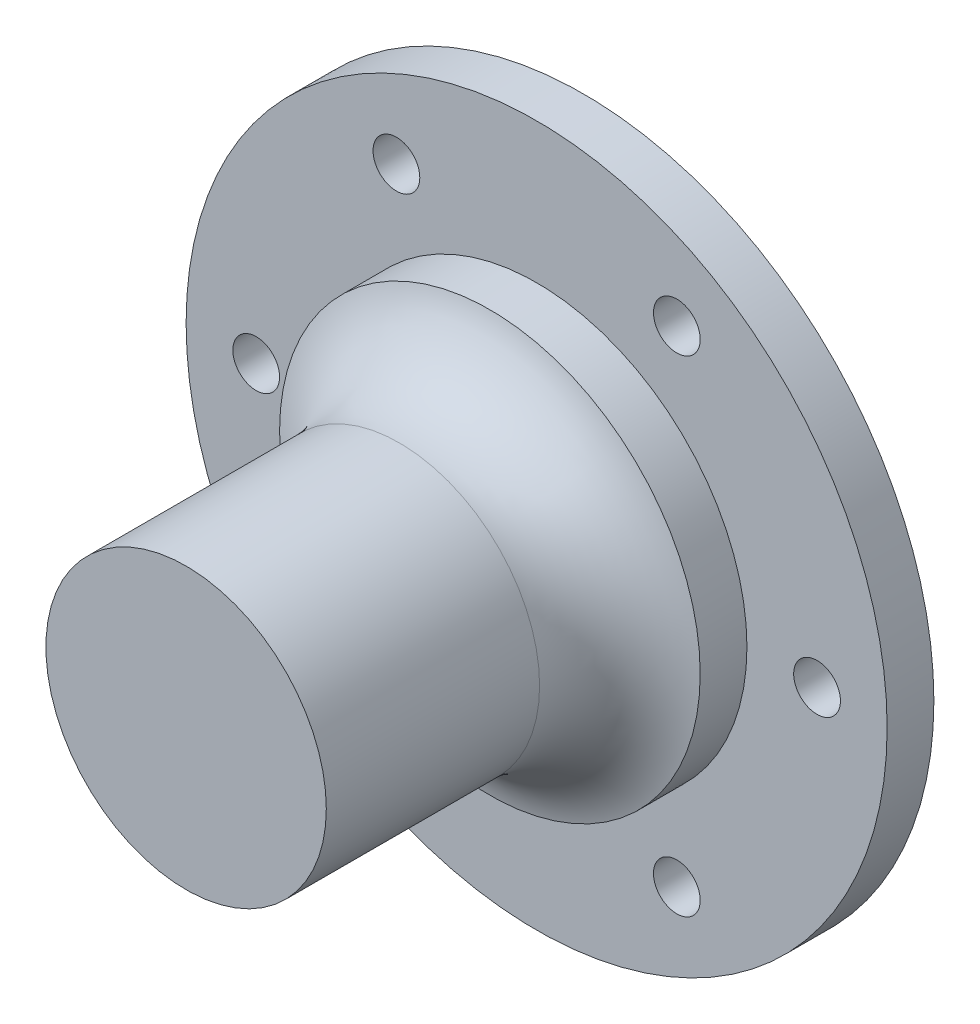
ISO-10303-21;
HEADER;
FILE_DESCRIPTION(('STEP AP214'),'2;1');
FILE_NAME('part.step','',(''),(''),'','','');
FILE_SCHEMA(('AUTOMOTIVE_DESIGN { 1 0 10303 214 1 1 1 1 }'));
ENDSEC;
DATA;
#1=APPLICATION_CONTEXT('core data for automotive mechanical design processes');
#2=APPLICATION_PROTOCOL_DEFINITION('international standard','automotive_design',2000,#1);
#3=PRODUCT_CONTEXT('',#1,'mechanical');
#4=PRODUCT('Part','Part','',(#3));
#5=PRODUCT_RELATED_PRODUCT_CATEGORY('part','',(#4));
#6=PRODUCT_DEFINITION_FORMATION('','',#4);
#7=PRODUCT_DEFINITION_CONTEXT('part definition',#1,'design');
#8=PRODUCT_DEFINITION('design','',#6,#7);
#9=PRODUCT_DEFINITION_SHAPE('','',#8);
#10=(LENGTH_UNIT() NAMED_UNIT(*) SI_UNIT(.MILLI.,.METRE.));
#11=(NAMED_UNIT(*) PLANE_ANGLE_UNIT() SI_UNIT($,.RADIAN.));
#12=(NAMED_UNIT(*) SI_UNIT($,.STERADIAN.) SOLID_ANGLE_UNIT());
#13=UNCERTAINTY_MEASURE_WITH_UNIT(LENGTH_MEASURE(1.E-05),#10,'distance_accuracy_value','');
#14=(GEOMETRIC_REPRESENTATION_CONTEXT(3) GLOBAL_UNCERTAINTY_ASSIGNED_CONTEXT((#13)) GLOBAL_UNIT_ASSIGNED_CONTEXT((#10,
#11,#12)) REPRESENTATION_CONTEXT('',''));
#15=CARTESIAN_POINT('',(0.,0.,0.));
#16=DIRECTION('',(0.,0.,1.));
#17=DIRECTION('',(1.,0.,0.));
#18=AXIS2_PLACEMENT_3D('',#15,#16,#17);
#19=CARTESIAN_POINT('',(0.,0.,10.));
#20=DIRECTION('',(0.,0.,-1.));
#21=DIRECTION('',(-1.,0.,0.));
#22=AXIS2_PLACEMENT_3D('',#19,#20,#21);
#23=CYLINDRICAL_SURFACE('',#22,75.);
#24=CARTESIAN_POINT('',(0.,0.,10.));
#25=DIRECTION('',(0.,0.,1.));
#26=DIRECTION('',(1.,0.,0.));
#27=AXIS2_PLACEMENT_3D('',#24,#25,#26);
#28=CIRCLE('',#27,75.);
#29=CARTESIAN_POINT('',(75.,0.,10.));
#30=VERTEX_POINT('',#29);
#31=EDGE_CURVE('E42',#30,#30,#28,.T.);
#32=ORIENTED_EDGE('',*,*,#31,.F.);
#33=EDGE_LOOP('',(#32));
#34=FACE_BOUND('',#33,.T.);
#35=CARTESIAN_POINT('',(0.,0.,0.));
#36=DIRECTION('',(0.,0.,1.));
#37=DIRECTION('',(1.,0.,0.));
#38=AXIS2_PLACEMENT_3D('',#35,#36,#37);
#39=CIRCLE('',#38,75.);
#40=CARTESIAN_POINT('',(75.,0.,0.));
#41=VERTEX_POINT('',#40);
#42=EDGE_CURVE('E57',#41,#41,#39,.T.);
#43=ORIENTED_EDGE('',*,*,#42,.T.);
#44=EDGE_LOOP('',(#43));
#45=FACE_BOUND('',#44,.T.);
#46=ADVANCED_FACE('F30',(#34,#45),#23,.T.);
#47=CARTESIAN_POINT('',(0.,0.,10.));
#48=DIRECTION('',(0.,0.,1.));
#49=DIRECTION('',(1.,0.,0.));
#50=AXIS2_PLACEMENT_3D('',#47,#48,#49);
#51=PLANE('',#50);
#52=CARTESIAN_POINT('',(60.,0.,10.));
#53=DIRECTION('',(0.,0.,1.));
#54=DIRECTION('',(1.,0.,0.));
#55=AXIS2_PLACEMENT_3D('',#52,#53,#54);
#56=CIRCLE('',#55,5.);
#57=CARTESIAN_POINT('',(65.,0.,10.));
#58=VERTEX_POINT('',#57);
#59=EDGE_CURVE('E66',#58,#58,#56,.T.);
#60=ORIENTED_EDGE('',*,*,#59,.F.);
#61=EDGE_LOOP('',(#60));
#62=FACE_BOUND('',#61,.T.);
#63=CARTESIAN_POINT('',(30.0000000000006,51.961524227066,10.));
#64=DIRECTION('',(0.,0.,1.));
#65=DIRECTION('',(1.,0.,0.));
#66=AXIS2_PLACEMENT_3D('',#63,#64,#65);
#67=CIRCLE('',#66,5.);
#68=CARTESIAN_POINT('',(35.0000000000006,51.961524227066,10.));
#69=VERTEX_POINT('',#68);
#70=EDGE_CURVE('E93',#69,#69,#67,.T.);
#71=ORIENTED_EDGE('',*,*,#70,.F.);
#72=EDGE_LOOP('',(#71));
#73=FACE_BOUND('',#72,.T.);
#74=CARTESIAN_POINT('',(-29.9999999999995,51.9615242270666,10.));
#75=DIRECTION('',(0.,0.,1.));
#76=DIRECTION('',(1.,0.,0.));
#77=AXIS2_PLACEMENT_3D('',#74,#75,#76);
#78=CIRCLE('',#77,5.);
#79=CARTESIAN_POINT('',(-24.9999999999995,51.9615242270666,10.));
#80=VERTEX_POINT('',#79);
#81=EDGE_CURVE('E89',#80,#80,#78,.T.);
#82=ORIENTED_EDGE('',*,*,#81,.F.);
#83=EDGE_LOOP('',(#82));
#84=FACE_BOUND('',#83,.T.);
#85=CARTESIAN_POINT('',(-60.,4.18977760661176E-13,10.));
#86=DIRECTION('',(0.,0.,1.));
#87=DIRECTION('',(1.,0.,0.));
#88=AXIS2_PLACEMENT_3D('',#85,#86,#87);
#89=CIRCLE('',#88,5.00000000000001);
#90=CARTESIAN_POINT('',(-55.,4.18977760661176E-13,10.));
#91=VERTEX_POINT('',#90);
#92=EDGE_CURVE('E92',#91,#91,#89,.T.);
#93=ORIENTED_EDGE('',*,*,#92,.F.);
#94=EDGE_LOOP('',(#93));
#95=FACE_BOUND('',#94,.T.);
#96=CARTESIAN_POINT('',(-30.0000000000002,-51.9615242270662,10.));
#97=DIRECTION('',(0.,0.,1.));
#98=DIRECTION('',(1.,0.,0.));
#99=AXIS2_PLACEMENT_3D('',#96,#97,#98);
#100=CIRCLE('',#99,5.00000000000001);
#101=CARTESIAN_POINT('',(-25.0000000000002,-51.9615242270662,10.));
#102=VERTEX_POINT('',#101);
#103=EDGE_CURVE('E96',#102,#102,#100,.T.);
#104=ORIENTED_EDGE('',*,*,#103,.F.);
#105=EDGE_LOOP('',(#104));
#106=FACE_BOUND('',#105,.T.);
#107=CARTESIAN_POINT('',(29.9999999999999,-51.9615242270664,10.));
#108=DIRECTION('',(0.,0.,1.));
#109=DIRECTION('',(1.,0.,0.));
#110=AXIS2_PLACEMENT_3D('',#107,#108,#109);
#111=CIRCLE('',#110,5.00000000000001);
#112=CARTESIAN_POINT('',(34.9999999999999,-51.9615242270664,10.));
#113=VERTEX_POINT('',#112);
#114=EDGE_CURVE('E99',#113,#113,#111,.T.);
#115=ORIENTED_EDGE('',*,*,#114,.F.);
#116=EDGE_LOOP('',(#115));
#117=FACE_BOUND('',#116,.T.);
#118=CARTESIAN_POINT('',(0.,0.,10.));
#119=DIRECTION('',(0.,0.,1.));
#120=DIRECTION('',(1.,0.,0.));
#121=AXIS2_PLACEMENT_3D('',#118,#119,#120);
#122=CIRCLE('',#121,45.);
#123=CARTESIAN_POINT('',(45.,0.,10.));
#124=VERTEX_POINT('',#123);
#125=EDGE_CURVE('E37',#124,#124,#122,.T.);
#126=ORIENTED_EDGE('',*,*,#125,.F.);
#127=EDGE_LOOP('',(#126));
#128=FACE_BOUND('',#127,.T.);
#129=ORIENTED_EDGE('',*,*,#31,.T.);
#130=EDGE_LOOP('',(#129));
#131=FACE_BOUND('',#130,.T.);
#132=ADVANCED_FACE('F110',(#62,#73,#84,#95,#106,#117,#128,#131),#51,.T.);
#133=CARTESIAN_POINT('',(0.,0.,0.));
#134=DIRECTION('',(0.,0.,1.));
#135=DIRECTION('',(1.,0.,0.));
#136=AXIS2_PLACEMENT_3D('',#133,#134,#135);
#137=PLANE('',#136);
#138=CARTESIAN_POINT('',(60.,0.,0.));
#139=DIRECTION('',(0.,0.,1.));
#140=DIRECTION('',(1.,0.,0.));
#141=AXIS2_PLACEMENT_3D('',#138,#139,#140);
#142=CIRCLE('',#141,5.);
#143=CARTESIAN_POINT('',(65.,0.,0.));
#144=VERTEX_POINT('',#143);
#145=EDGE_CURVE('E33',#144,#144,#142,.T.);
#146=ORIENTED_EDGE('',*,*,#145,.T.);
#147=EDGE_LOOP('',(#146));
#148=FACE_BOUND('',#147,.T.);
#149=CARTESIAN_POINT('',(30.0000000000006,51.961524227066,0.));
#150=DIRECTION('',(0.,0.,1.));
#151=DIRECTION('',(1.,0.,0.));
#152=AXIS2_PLACEMENT_3D('',#149,#150,#151);
#153=CIRCLE('',#152,5.);
#154=CARTESIAN_POINT('',(35.0000000000006,51.961524227066,0.));
#155=VERTEX_POINT('',#154);
#156=EDGE_CURVE('E74',#155,#155,#153,.T.);
#157=ORIENTED_EDGE('',*,*,#156,.T.);
#158=EDGE_LOOP('',(#157));
#159=FACE_BOUND('',#158,.T.);
#160=CARTESIAN_POINT('',(-29.9999999999995,51.9615242270666,0.));
#161=DIRECTION('',(0.,0.,1.));
#162=DIRECTION('',(1.,0.,0.));
#163=AXIS2_PLACEMENT_3D('',#160,#161,#162);
#164=CIRCLE('',#163,5.);
#165=CARTESIAN_POINT('',(-24.9999999999995,51.9615242270666,0.));
#166=VERTEX_POINT('',#165);
#167=EDGE_CURVE('E72',#166,#166,#164,.T.);
#168=ORIENTED_EDGE('',*,*,#167,.T.);
#169=EDGE_LOOP('',(#168));
#170=FACE_BOUND('',#169,.T.);
#171=CARTESIAN_POINT('',(-60.,4.18977760661176E-13,0.));
#172=DIRECTION('',(0.,0.,1.));
#173=DIRECTION('',(1.,0.,0.));
#174=AXIS2_PLACEMENT_3D('',#171,#172,#173);
#175=CIRCLE('',#174,5.00000000000001);
#176=CARTESIAN_POINT('',(-55.,4.18977760661176E-13,0.));
#177=VERTEX_POINT('',#176);
#178=EDGE_CURVE('E69',#177,#177,#175,.T.);
#179=ORIENTED_EDGE('',*,*,#178,.T.);
#180=EDGE_LOOP('',(#179));
#181=FACE_BOUND('',#180,.T.);
#182=CARTESIAN_POINT('',(-30.0000000000002,-51.9615242270662,0.));
#183=DIRECTION('',(0.,0.,1.));
#184=DIRECTION('',(1.,0.,0.));
#185=AXIS2_PLACEMENT_3D('',#182,#183,#184);
#186=CIRCLE('',#185,5.00000000000001);
#187=CARTESIAN_POINT('',(-25.0000000000002,-51.9615242270662,0.));
#188=VERTEX_POINT('',#187);
#189=EDGE_CURVE('E65',#188,#188,#186,.T.);
#190=ORIENTED_EDGE('',*,*,#189,.T.);
#191=EDGE_LOOP('',(#190));
#192=FACE_BOUND('',#191,.T.);
#193=CARTESIAN_POINT('',(29.9999999999999,-51.9615242270664,0.));
#194=DIRECTION('',(0.,0.,1.));
#195=DIRECTION('',(1.,0.,0.));
#196=AXIS2_PLACEMENT_3D('',#193,#194,#195);
#197=CIRCLE('',#196,5.00000000000001);
#198=CARTESIAN_POINT('',(34.9999999999999,-51.9615242270664,0.));
#199=VERTEX_POINT('',#198);
#200=EDGE_CURVE('E62',#199,#199,#197,.T.);
#201=ORIENTED_EDGE('',*,*,#200,.T.);
#202=EDGE_LOOP('',(#201));
#203=FACE_BOUND('',#202,.T.);
#204=CARTESIAN_POINT('',(0.,0.,0.));
#205=DIRECTION('',(0.,0.,-1.));
#206=DIRECTION('',(-1.,0.,0.));
#207=AXIS2_PLACEMENT_3D('',#204,#205,#206);
#208=CIRCLE('',#207,40.);
#209=CARTESIAN_POINT('',(-40.,0.,0.));
#210=VERTEX_POINT('',#209);
#211=EDGE_CURVE('E10',#210,#210,#208,.T.);
#212=ORIENTED_EDGE('',*,*,#211,.F.);
#213=EDGE_LOOP('',(#212));
#214=FACE_BOUND('',#213,.T.);
#215=ORIENTED_EDGE('',*,*,#42,.F.);
#216=EDGE_LOOP('',(#215));
#217=FACE_BOUND('',#216,.T.);
#218=ADVANCED_FACE('F113',(#148,#159,#170,#181,#192,#203,#214,#217),#137,.F.);
#219=CARTESIAN_POINT('',(0.,30.,85.));
#220=DIRECTION('',(0.,0.,-1.));
#221=DIRECTION('',(-1.,0.,0.));
#222=AXIS2_PLACEMENT_3D('',#219,#220,#221);
#223=PLANE('',#222);
#224=CARTESIAN_POINT('',(0.,0.,85.));
#225=DIRECTION('',(0.,0.,1.));
#226=DIRECTION('',(1.,0.,0.));
#227=AXIS2_PLACEMENT_3D('',#224,#225,#226);
#228=CIRCLE('',#227,30.);
#229=CARTESIAN_POINT('',(30.,0.,85.));
#230=VERTEX_POINT('',#229);
#231=EDGE_CURVE('E54',#230,#230,#228,.T.);
#232=ORIENTED_EDGE('',*,*,#231,.T.);
#233=EDGE_LOOP('',(#232));
#234=FACE_BOUND('',#233,.T.);
#235=ADVANCED_FACE('F134',(#234),#223,.F.);
#236=CARTESIAN_POINT('',(0.,0.,1000.));
#237=DIRECTION('',(0.,0.,1.));
#238=DIRECTION('',(1.,0.,0.));
#239=AXIS2_PLACEMENT_3D('',#236,#237,#238);
#240=CYLINDRICAL_SURFACE('',#239,30.);
#241=ORIENTED_EDGE('',*,*,#231,.F.);
#242=EDGE_LOOP('',(#241));
#243=FACE_BOUND('',#242,.T.);
#244=CARTESIAN_POINT('',(0.,0.,39.364916731037));
#245=DIRECTION('',(0.,0.,1.));
#246=DIRECTION('',(1.,0.,0.));
#247=AXIS2_PLACEMENT_3D('',#244,#245,#246);
#248=CIRCLE('',#247,30.);
#249=CARTESIAN_POINT('',(30.,0.,39.364916731037));
#250=VERTEX_POINT('',#249);
#251=EDGE_CURVE('E51',#250,#250,#248,.T.);
#252=ORIENTED_EDGE('',*,*,#251,.T.);
#253=EDGE_LOOP('',(#252));
#254=FACE_BOUND('',#253,.T.);
#255=ADVANCED_FACE('F138',(#243,#254),#240,.T.);
#256=CARTESIAN_POINT('',(0.,0.,39.3649167310371));
#257=DIRECTION('',(0.,0.,1.));
#258=DIRECTION('',(1.,0.,0.));
#259=AXIS2_PLACEMENT_3D('',#256,#257,#258);
#260=TOROIDAL_SURFACE('',#259,50.,20.);
#261=ORIENTED_EDGE('',*,*,#251,.F.);
#262=EDGE_LOOP('',(#261));
#263=FACE_BOUND('',#262,.T.);
#264=CARTESIAN_POINT('',(0.,0.,20.));
#265=DIRECTION('',(0.,0.,1.));
#266=DIRECTION('',(1.,0.,0.));
#267=AXIS2_PLACEMENT_3D('',#264,#265,#266);
#268=CIRCLE('',#267,45.);
#269=CARTESIAN_POINT('',(45.,0.,20.));
#270=VERTEX_POINT('',#269);
#271=EDGE_CURVE('E48',#270,#270,#268,.T.);
#272=ORIENTED_EDGE('',*,*,#271,.T.);
#273=EDGE_LOOP('',(#272));
#274=FACE_BOUND('',#273,.T.);
#275=ADVANCED_FACE('F144',(#263,#274),#260,.F.);
#276=CARTESIAN_POINT('',(0.,0.,1000.));
#277=DIRECTION('',(0.,0.,1.));
#278=DIRECTION('',(1.,0.,0.));
#279=AXIS2_PLACEMENT_3D('',#276,#277,#278);
#280=CYLINDRICAL_SURFACE('',#279,45.);
#281=ORIENTED_EDGE('',*,*,#271,.F.);
#282=EDGE_LOOP('',(#281));
#283=FACE_BOUND('',#282,.T.);
#284=ORIENTED_EDGE('',*,*,#125,.T.);
#285=EDGE_LOOP('',(#284));
#286=FACE_BOUND('',#285,.T.);
#287=ADVANCED_FACE('F148',(#283,#286),#280,.T.);
#288=CARTESIAN_POINT('',(0.,0.,-10.));
#289=DIRECTION('',(0.,0.,1.));
#290=DIRECTION('',(1.,0.,0.));
#291=AXIS2_PLACEMENT_3D('',#288,#289,#290);
#292=CYLINDRICAL_SURFACE('',#291,40.);
#293=CARTESIAN_POINT('',(0.,0.,-10.));
#294=DIRECTION('',(0.,0.,-1.));
#295=DIRECTION('',(-1.,0.,0.));
#296=AXIS2_PLACEMENT_3D('',#293,#294,#295);
#297=CIRCLE('',#296,40.);
#298=CARTESIAN_POINT('',(-40.,0.,-10.));
#299=VERTEX_POINT('',#298);
#300=EDGE_CURVE('E45',#299,#299,#297,.T.);
#301=ORIENTED_EDGE('',*,*,#300,.F.);
#302=EDGE_LOOP('',(#301));
#303=FACE_BOUND('',#302,.T.);
#304=ORIENTED_EDGE('',*,*,#211,.T.);
#305=EDGE_LOOP('',(#304));
#306=FACE_BOUND('',#305,.T.);
#307=ADVANCED_FACE('F152',(#303,#306),#292,.T.);
#308=CARTESIAN_POINT('',(0.,0.,-10.));
#309=DIRECTION('',(0.,0.,-1.));
#310=DIRECTION('',(-1.,0.,0.));
#311=AXIS2_PLACEMENT_3D('',#308,#309,#310);
#312=PLANE('',#311);
#313=CARTESIAN_POINT('',(0.,0.,-10.));
#314=DIRECTION('',(0.,0.,-1.));
#315=DIRECTION('',(-1.,0.,0.));
#316=AXIS2_PLACEMENT_3D('',#313,#314,#315);
#317=CIRCLE('',#316,35.);
#318=CARTESIAN_POINT('',(-35.,0.,-10.));
#319=VERTEX_POINT('',#318);
#320=EDGE_CURVE('E79',#319,#319,#317,.T.);
#321=ORIENTED_EDGE('',*,*,#320,.F.);
#322=EDGE_LOOP('',(#321));
#323=FACE_BOUND('',#322,.T.);
#324=ORIENTED_EDGE('',*,*,#300,.T.);
#325=EDGE_LOOP('',(#324));
#326=FACE_BOUND('',#325,.T.);
#327=ADVANCED_FACE('F156',(#323,#326),#312,.T.);
#328=CARTESIAN_POINT('',(0.,0.,10.));
#329=DIRECTION('',(0.,0.,-1.));
#330=DIRECTION('',(-1.,0.,0.));
#331=AXIS2_PLACEMENT_3D('',#328,#329,#330);
#332=CYLINDRICAL_SURFACE('',#331,35.);
#333=CARTESIAN_POINT('',(0.,0.,10.));
#334=DIRECTION('',(0.,0.,-1.));
#335=DIRECTION('',(-1.,0.,0.));
#336=AXIS2_PLACEMENT_3D('',#333,#334,#335);
#337=CIRCLE('',#336,35.);
#338=CARTESIAN_POINT('',(-35.,0.,10.));
#339=VERTEX_POINT('',#338);
#340=EDGE_CURVE('E83',#339,#339,#337,.T.);
#341=ORIENTED_EDGE('',*,*,#340,.F.);
#342=EDGE_LOOP('',(#341));
#343=FACE_BOUND('',#342,.T.);
#344=ORIENTED_EDGE('',*,*,#320,.T.);
#345=EDGE_LOOP('',(#344));
#346=FACE_BOUND('',#345,.T.);
#347=ADVANCED_FACE('F160',(#343,#346),#332,.F.);
#348=CARTESIAN_POINT('',(0.,0.,10.));
#349=DIRECTION('',(0.,0.,-1.));
#350=DIRECTION('',(-1.,0.,0.));
#351=AXIS2_PLACEMENT_3D('',#348,#349,#350);
#352=PLANE('',#351);
#353=ORIENTED_EDGE('',*,*,#340,.T.);
#354=EDGE_LOOP('',(#353));
#355=FACE_BOUND('',#354,.T.);
#356=ADVANCED_FACE('F164',(#355),#352,.T.);
#357=CARTESIAN_POINT('',(29.9999999999999,-51.9615242270664,-10.));
#358=DIRECTION('',(0.,0.,1.));
#359=DIRECTION('',(1.,0.,0.));
#360=AXIS2_PLACEMENT_3D('',#357,#358,#359);
#361=CYLINDRICAL_SURFACE('',#360,5.00000000000001);
#362=ORIENTED_EDGE('',*,*,#114,.T.);
#363=EDGE_LOOP('',(#362));
#364=FACE_BOUND('',#363,.T.);
#365=ORIENTED_EDGE('',*,*,#200,.F.);
#366=EDGE_LOOP('',(#365));
#367=FACE_BOUND('',#366,.T.);
#368=ADVANCED_FACE('F168',(#364,#367),#361,.F.);
#369=CARTESIAN_POINT('',(-30.0000000000002,-51.9615242270662,-10.));
#370=DIRECTION('',(0.,0.,1.));
#371=DIRECTION('',(1.,0.,0.));
#372=AXIS2_PLACEMENT_3D('',#369,#370,#371);
#373=CYLINDRICAL_SURFACE('',#372,5.00000000000001);
#374=ORIENTED_EDGE('',*,*,#103,.T.);
#375=EDGE_LOOP('',(#374));
#376=FACE_BOUND('',#375,.T.);
#377=ORIENTED_EDGE('',*,*,#189,.F.);
#378=EDGE_LOOP('',(#377));
#379=FACE_BOUND('',#378,.T.);
#380=ADVANCED_FACE('F178',(#376,#379),#373,.F.);
#381=CARTESIAN_POINT('',(-60.,4.18977760661176E-13,-10.));
#382=DIRECTION('',(0.,0.,1.));
#383=DIRECTION('',(1.,0.,0.));
#384=AXIS2_PLACEMENT_3D('',#381,#382,#383);
#385=CYLINDRICAL_SURFACE('',#384,5.00000000000001);
#386=ORIENTED_EDGE('',*,*,#92,.T.);
#387=EDGE_LOOP('',(#386));
#388=FACE_BOUND('',#387,.T.);
#389=ORIENTED_EDGE('',*,*,#178,.F.);
#390=EDGE_LOOP('',(#389));
#391=FACE_BOUND('',#390,.T.);
#392=ADVANCED_FACE('F174',(#388,#391),#385,.F.);
#393=CARTESIAN_POINT('',(-29.9999999999995,51.9615242270666,-10.));
#394=DIRECTION('',(0.,0.,1.));
#395=DIRECTION('',(1.,0.,0.));
#396=AXIS2_PLACEMENT_3D('',#393,#394,#395);
#397=CYLINDRICAL_SURFACE('',#396,5.);
#398=ORIENTED_EDGE('',*,*,#81,.T.);
#399=EDGE_LOOP('',(#398));
#400=FACE_BOUND('',#399,.T.);
#401=ORIENTED_EDGE('',*,*,#167,.F.);
#402=EDGE_LOOP('',(#401));
#403=FACE_BOUND('',#402,.T.);
#404=ADVANCED_FACE('F170',(#400,#403),#397,.F.);
#405=CARTESIAN_POINT('',(30.0000000000006,51.961524227066,-10.));
#406=DIRECTION('',(0.,0.,1.));
#407=DIRECTION('',(1.,0.,0.));
#408=AXIS2_PLACEMENT_3D('',#405,#406,#407);
#409=CYLINDRICAL_SURFACE('',#408,5.);
#410=ORIENTED_EDGE('',*,*,#70,.T.);
#411=EDGE_LOOP('',(#410));
#412=FACE_BOUND('',#411,.T.);
#413=ORIENTED_EDGE('',*,*,#156,.F.);
#414=EDGE_LOOP('',(#413));
#415=FACE_BOUND('',#414,.T.);
#416=ADVANCED_FACE('F173',(#412,#415),#409,.F.);
#417=CARTESIAN_POINT('',(60.,0.,-10.));
#418=DIRECTION('',(0.,0.,1.));
#419=DIRECTION('',(1.,0.,0.));
#420=AXIS2_PLACEMENT_3D('',#417,#418,#419);
#421=CYLINDRICAL_SURFACE('',#420,5.);
#422=ORIENTED_EDGE('',*,*,#59,.T.);
#423=EDGE_LOOP('',(#422));
#424=FACE_BOUND('',#423,.T.);
#425=ORIENTED_EDGE('',*,*,#145,.F.);
#426=EDGE_LOOP('',(#425));
#427=FACE_BOUND('',#426,.T.);
#428=ADVANCED_FACE('F107',(#424,#427),#421,.F.);
#429=CLOSED_SHELL('',(#46,#132,#218,#235,#255,#275,#287,#307,#327,#347,#356,#368,#380,#392,#404,
#416,#428));
#430=MANIFOLD_SOLID_BREP('B2',#429);
#431=ADVANCED_BREP_SHAPE_REPRESENTATION('',(#18,#430),#14);
#432=SHAPE_DEFINITION_REPRESENTATION(#9,#431);
ENDSEC;
END-ISO-10303-21;
